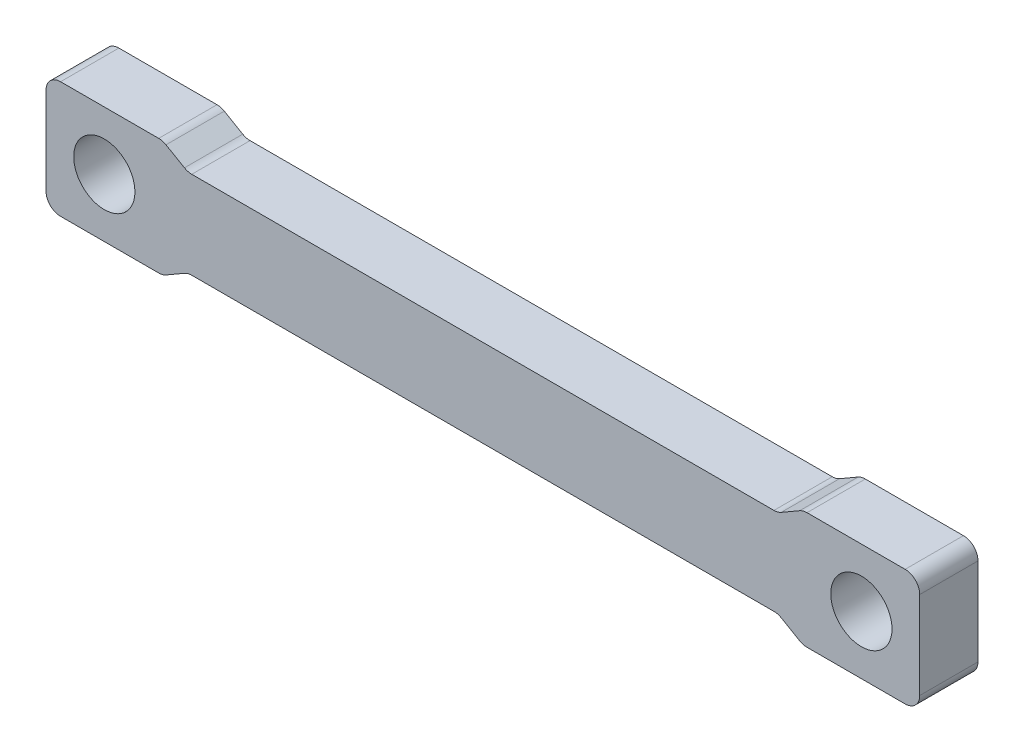
ISO-10303-21;
HEADER;
FILE_DESCRIPTION(('STEP AP214'),'2;1');
FILE_NAME('part.step','',(''),(''),'','','');
FILE_SCHEMA(('AUTOMOTIVE_DESIGN { 1 0 10303 214 1 1 1 1 }'));
ENDSEC;
DATA;
#1=APPLICATION_CONTEXT('core data for automotive mechanical design processes');
#2=APPLICATION_PROTOCOL_DEFINITION('international standard','automotive_design',2000,#1);
#3=PRODUCT_CONTEXT('',#1,'mechanical');
#4=PRODUCT('Part','Part','',(#3));
#5=PRODUCT_RELATED_PRODUCT_CATEGORY('part','',(#4));
#6=PRODUCT_DEFINITION_FORMATION('','',#4);
#7=PRODUCT_DEFINITION_CONTEXT('part definition',#1,'design');
#8=PRODUCT_DEFINITION('design','',#6,#7);
#9=PRODUCT_DEFINITION_SHAPE('','',#8);
#10=(LENGTH_UNIT() NAMED_UNIT(*) SI_UNIT(.MILLI.,.METRE.));
#11=(NAMED_UNIT(*) PLANE_ANGLE_UNIT() SI_UNIT($,.RADIAN.));
#12=(NAMED_UNIT(*) SI_UNIT($,.STERADIAN.) SOLID_ANGLE_UNIT());
#13=UNCERTAINTY_MEASURE_WITH_UNIT(LENGTH_MEASURE(1.E-05),#10,'distance_accuracy_value','');
#14=(GEOMETRIC_REPRESENTATION_CONTEXT(3) GLOBAL_UNCERTAINTY_ASSIGNED_CONTEXT((#13)) GLOBAL_UNIT_ASSIGNED_CONTEXT((#10,
#11,#12)) REPRESENTATION_CONTEXT('',''));
#15=CARTESIAN_POINT('',(0.,0.,0.));
#16=DIRECTION('',(0.,0.,1.));
#17=DIRECTION('',(1.,0.,0.));
#18=AXIS2_PLACEMENT_3D('',#15,#16,#17);
#19=CARTESIAN_POINT('',(-26.7785361810537,14.6,-10.));
#20=DIRECTION('',(0.,0.,1.));
#21=DIRECTION('',(1.,0.,0.));
#22=AXIS2_PLACEMENT_3D('',#19,#20,#21);
#23=CYLINDRICAL_SURFACE('',#22,1.05);
#24=CARTESIAN_POINT('',(-26.7785361810537,14.6,0.));
#25=DIRECTION('',(0.,0.,1.));
#26=DIRECTION('',(1.,0.,0.));
#27=AXIS2_PLACEMENT_3D('',#24,#25,#26);
#28=CIRCLE('',#27,1.05);
#29=CARTESIAN_POINT('',(-25.7285361810537,14.6,0.));
#30=VERTEX_POINT('',#29);
#31=EDGE_CURVE('E445',#30,#30,#28,.F.);
#32=ORIENTED_EDGE('',*,*,#31,.T.);
#33=EDGE_LOOP('',(#32));
#34=FACE_BOUND('',#33,.T.);
#35=CARTESIAN_POINT('',(-26.7785361810537,14.6,2.));
#36=DIRECTION('',(0.,0.,1.));
#37=DIRECTION('',(1.,0.,0.));
#38=AXIS2_PLACEMENT_3D('',#35,#36,#37);
#39=CIRCLE('',#38,1.05);
#40=CARTESIAN_POINT('',(-25.7285361810537,14.6,2.));
#41=VERTEX_POINT('',#40);
#42=EDGE_CURVE('E442',#41,#41,#39,.T.);
#43=ORIENTED_EDGE('',*,*,#42,.T.);
#44=EDGE_LOOP('',(#43));
#45=FACE_BOUND('',#44,.T.);
#46=ADVANCED_FACE('F67',(#34,#45),#23,.F.);
#47=CARTESIAN_POINT('',(-52.75,14.6,-10.));
#48=DIRECTION('',(0.,0.,1.));
#49=DIRECTION('',(1.,0.,0.));
#50=AXIS2_PLACEMENT_3D('',#47,#48,#49);
#51=CYLINDRICAL_SURFACE('',#50,1.05);
#52=CARTESIAN_POINT('',(-52.75,14.6,0.));
#53=DIRECTION('',(0.,0.,1.));
#54=DIRECTION('',(1.,0.,0.));
#55=AXIS2_PLACEMENT_3D('',#52,#53,#54);
#56=CIRCLE('',#55,1.05);
#57=CARTESIAN_POINT('',(-51.7,14.6,0.));
#58=VERTEX_POINT('',#57);
#59=EDGE_CURVE('E448',#58,#58,#56,.F.);
#60=ORIENTED_EDGE('',*,*,#59,.T.);
#61=EDGE_LOOP('',(#60));
#62=FACE_BOUND('',#61,.T.);
#63=CARTESIAN_POINT('',(-52.75,14.6,2.));
#64=DIRECTION('',(0.,0.,1.));
#65=DIRECTION('',(1.,0.,0.));
#66=AXIS2_PLACEMENT_3D('',#63,#64,#65);
#67=CIRCLE('',#66,1.05);
#68=CARTESIAN_POINT('',(-51.7,14.6,2.));
#69=VERTEX_POINT('',#68);
#70=EDGE_CURVE('E380',#69,#69,#67,.T.);
#71=ORIENTED_EDGE('',*,*,#70,.T.);
#72=EDGE_LOOP('',(#71));
#73=FACE_BOUND('',#72,.T.);
#74=ADVANCED_FACE('F452',(#62,#73),#51,.F.);
#75=CARTESIAN_POINT('',(0.,0.,2.));
#76=DIRECTION('',(0.,0.,1.));
#77=DIRECTION('',(1.,0.,0.));
#78=AXIS2_PLACEMENT_3D('',#75,#76,#77);
#79=PLANE('',#78);
#80=ORIENTED_EDGE('',*,*,#70,.F.);
#81=EDGE_LOOP('',(#80));
#82=FACE_BOUND('',#81,.T.);
#83=DIRECTION('',(-1.,0.,0.));
#84=VECTOR('',#83,1.);
#85=CARTESIAN_POINT('',(-24.7785361810537,16.6,2.));
#86=LINE('',#85,#84);
#87=CARTESIAN_POINT('',(-25.2785361810537,16.6,2.));
#88=VERTEX_POINT('',#87);
#89=CARTESIAN_POINT('',(-28.6445615848381,16.6,2.));
#90=VERTEX_POINT('',#89);
#91=EDGE_CURVE('E413',#88,#90,#86,.T.);
#92=ORIENTED_EDGE('',*,*,#91,.T.);
#93=CARTESIAN_POINT('',(-28.6445615848381,16.1,2.));
#94=DIRECTION('',(0.,0.,1.));
#95=DIRECTION('',(1.,0.,0.));
#96=AXIS2_PLACEMENT_3D('',#93,#94,#95);
#97=CIRCLE('',#96,0.5);
#98=CARTESIAN_POINT('',(-28.8945615848381,16.5330127018922,2.));
#99=VERTEX_POINT('',#98);
#100=EDGE_CURVE('E299',#90,#99,#97,.T.);
#101=ORIENTED_EDGE('',*,*,#100,.T.);
#102=DIRECTION('',(-0.866025403784438,-0.500000000000002,0.));
#103=VECTOR('',#102,1.);
#104=CARTESIAN_POINT('',(-28.7785361810537,16.6,2.));
#105=LINE('',#104,#103);
#106=CARTESIAN_POINT('',(-29.5285361810537,16.1669872981078,2.));
#107=VERTEX_POINT('',#106);
#108=EDGE_CURVE('E248',#99,#107,#105,.T.);
#109=ORIENTED_EDGE('',*,*,#108,.T.);
#110=CARTESIAN_POINT('',(-29.7785361810537,16.6,2.));
#111=DIRECTION('',(0.,0.,1.));
#112=DIRECTION('',(1.,0.,0.));
#113=AXIS2_PLACEMENT_3D('',#110,#111,#112);
#114=CIRCLE('',#113,0.5);
#115=CARTESIAN_POINT('',(-29.7785361810537,16.1,2.));
#116=VERTEX_POINT('',#115);
#117=EDGE_CURVE('E351',#107,#116,#114,.F.);
#118=ORIENTED_EDGE('',*,*,#117,.T.);
#119=DIRECTION('',(-1.,0.,0.));
#120=VECTOR('',#119,1.);
#121=CARTESIAN_POINT('',(-29.6445615848381,16.1,2.));
#122=LINE('',#121,#120);
#123=CARTESIAN_POINT('',(-49.75,16.1,2.));
#124=VERTEX_POINT('',#123);
#125=EDGE_CURVE('E371',#116,#124,#122,.T.);
#126=ORIENTED_EDGE('',*,*,#125,.T.);
#127=CARTESIAN_POINT('',(-49.75,16.6,2.));
#128=DIRECTION('',(0.,0.,1.));
#129=DIRECTION('',(1.,0.,0.));
#130=AXIS2_PLACEMENT_3D('',#127,#128,#129);
#131=CIRCLE('',#130,0.5);
#132=CARTESIAN_POINT('',(-50.,16.1669872981078,2.));
#133=VERTEX_POINT('',#132);
#134=EDGE_CURVE('E12',#124,#133,#131,.F.);
#135=ORIENTED_EDGE('',*,*,#134,.T.);
#136=DIRECTION('',(-0.866025403784439,0.499999999999999,0.));
#137=VECTOR('',#136,1.);
#138=CARTESIAN_POINT('',(-49.8839745962156,16.1,2.));
#139=LINE('',#138,#137);
#140=CARTESIAN_POINT('',(-50.6339745962156,16.5330127018922,2.));
#141=VERTEX_POINT('',#140);
#142=EDGE_CURVE('E268',#133,#141,#139,.T.);
#143=ORIENTED_EDGE('',*,*,#142,.T.);
#144=CARTESIAN_POINT('',(-50.8839745962156,16.1,2.));
#145=DIRECTION('',(0.,0.,1.));
#146=DIRECTION('',(1.,0.,0.));
#147=AXIS2_PLACEMENT_3D('',#144,#145,#146);
#148=CIRCLE('',#147,0.5);
#149=CARTESIAN_POINT('',(-50.8839745962156,16.6,2.));
#150=VERTEX_POINT('',#149);
#151=EDGE_CURVE('E289',#141,#150,#148,.T.);
#152=ORIENTED_EDGE('',*,*,#151,.T.);
#153=DIRECTION('',(-1.,0.,0.));
#154=VECTOR('',#153,1.);
#155=CARTESIAN_POINT('',(-50.75,16.6,2.));
#156=LINE('',#155,#154);
#157=CARTESIAN_POINT('',(-54.25,16.6,2.));
#158=VERTEX_POINT('',#157);
#159=EDGE_CURVE('E267',#150,#158,#156,.T.);
#160=ORIENTED_EDGE('',*,*,#159,.T.);
#161=CARTESIAN_POINT('',(-54.25,16.1,2.));
#162=DIRECTION('',(0.,0.,1.));
#163=DIRECTION('',(1.,0.,0.));
#164=AXIS2_PLACEMENT_3D('',#161,#162,#163);
#165=CIRCLE('',#164,0.5);
#166=CARTESIAN_POINT('',(-54.75,16.1,2.));
#167=VERTEX_POINT('',#166);
#168=EDGE_CURVE('E285',#158,#167,#165,.T.);
#169=ORIENTED_EDGE('',*,*,#168,.T.);
#170=DIRECTION('',(0.,-1.,0.));
#171=VECTOR('',#170,1.);
#172=CARTESIAN_POINT('',(-54.75,16.6,2.));
#173=LINE('',#172,#171);
#174=CARTESIAN_POINT('',(-54.75,13.1,2.));
#175=VERTEX_POINT('',#174);
#176=EDGE_CURVE('E435',#167,#175,#173,.T.);
#177=ORIENTED_EDGE('',*,*,#176,.T.);
#178=CARTESIAN_POINT('',(-54.25,13.1,2.));
#179=DIRECTION('',(0.,0.,1.));
#180=DIRECTION('',(1.,0.,0.));
#181=AXIS2_PLACEMENT_3D('',#178,#179,#180);
#182=CIRCLE('',#181,0.5);
#183=CARTESIAN_POINT('',(-54.25,12.6,2.));
#184=VERTEX_POINT('',#183);
#185=EDGE_CURVE('E287',#175,#184,#182,.T.);
#186=ORIENTED_EDGE('',*,*,#185,.T.);
#187=DIRECTION('',(1.,0.,0.));
#188=VECTOR('',#187,1.);
#189=CARTESIAN_POINT('',(-54.75,12.6,2.));
#190=LINE('',#189,#188);
#191=CARTESIAN_POINT('',(-50.8839745962156,12.6,2.));
#192=VERTEX_POINT('',#191);
#193=EDGE_CURVE('E432',#184,#192,#190,.T.);
#194=ORIENTED_EDGE('',*,*,#193,.T.);
#195=CARTESIAN_POINT('',(-50.8839745962156,13.1,2.));
#196=DIRECTION('',(0.,0.,1.));
#197=DIRECTION('',(1.,0.,0.));
#198=AXIS2_PLACEMENT_3D('',#195,#196,#197);
#199=CIRCLE('',#198,0.5);
#200=CARTESIAN_POINT('',(-50.6339745962156,12.6669872981078,2.));
#201=VERTEX_POINT('',#200);
#202=EDGE_CURVE('E291',#192,#201,#199,.T.);
#203=ORIENTED_EDGE('',*,*,#202,.T.);
#204=DIRECTION('',(0.866025403784438,0.500000000000002,0.));
#205=VECTOR('',#204,1.);
#206=CARTESIAN_POINT('',(-50.75,12.6,2.));
#207=LINE('',#206,#205);
#208=CARTESIAN_POINT('',(-50.,13.0330127018922,2.));
#209=VERTEX_POINT('',#208);
#210=EDGE_CURVE('E429',#201,#209,#207,.T.);
#211=ORIENTED_EDGE('',*,*,#210,.T.);
#212=CARTESIAN_POINT('',(-49.75,12.6,2.));
#213=DIRECTION('',(0.,0.,1.));
#214=DIRECTION('',(1.,0.,0.));
#215=AXIS2_PLACEMENT_3D('',#212,#213,#214);
#216=CIRCLE('',#215,0.5);
#217=CARTESIAN_POINT('',(-49.75,13.1,2.));
#218=VERTEX_POINT('',#217);
#219=EDGE_CURVE('E359',#209,#218,#216,.F.);
#220=ORIENTED_EDGE('',*,*,#219,.T.);
#221=DIRECTION('',(1.,0.,0.));
#222=VECTOR('',#221,1.);
#223=CARTESIAN_POINT('',(-49.8839745962156,13.1,2.));
#224=LINE('',#223,#222);
#225=CARTESIAN_POINT('',(-29.7785361810536,13.1,2.));
#226=VERTEX_POINT('',#225);
#227=EDGE_CURVE('E426',#218,#226,#224,.T.);
#228=ORIENTED_EDGE('',*,*,#227,.T.);
#229=CARTESIAN_POINT('',(-29.7785361810536,12.6,2.));
#230=DIRECTION('',(0.,0.,1.));
#231=DIRECTION('',(1.,0.,0.));
#232=AXIS2_PLACEMENT_3D('',#229,#230,#231);
#233=CIRCLE('',#232,0.5);
#234=CARTESIAN_POINT('',(-29.5285361810536,13.0330127018922,2.));
#235=VERTEX_POINT('',#234);
#236=EDGE_CURVE('E355',#226,#235,#233,.F.);
#237=ORIENTED_EDGE('',*,*,#236,.T.);
#238=DIRECTION('',(0.866025403784438,-0.500000000000002,0.));
#239=VECTOR('',#238,1.);
#240=CARTESIAN_POINT('',(-29.6445615848381,13.1,2.));
#241=LINE('',#240,#239);
#242=CARTESIAN_POINT('',(-28.8945615848381,12.6669872981078,2.));
#243=VERTEX_POINT('',#242);
#244=EDGE_CURVE('E423',#235,#243,#241,.T.);
#245=ORIENTED_EDGE('',*,*,#244,.T.);
#246=CARTESIAN_POINT('',(-28.6445615848381,13.1,2.));
#247=DIRECTION('',(0.,0.,1.));
#248=DIRECTION('',(1.,0.,0.));
#249=AXIS2_PLACEMENT_3D('',#246,#247,#248);
#250=CIRCLE('',#249,0.5);
#251=CARTESIAN_POINT('',(-28.6445615848381,12.6,2.));
#252=VERTEX_POINT('',#251);
#253=EDGE_CURVE('E293',#243,#252,#250,.T.);
#254=ORIENTED_EDGE('',*,*,#253,.T.);
#255=DIRECTION('',(1.,0.,0.));
#256=VECTOR('',#255,1.);
#257=CARTESIAN_POINT('',(-28.7785361810537,12.6,2.));
#258=LINE('',#257,#256);
#259=CARTESIAN_POINT('',(-25.2785361810537,12.6,2.));
#260=VERTEX_POINT('',#259);
#261=EDGE_CURVE('E418',#252,#260,#258,.T.);
#262=ORIENTED_EDGE('',*,*,#261,.T.);
#263=CARTESIAN_POINT('',(-25.2785361810537,13.1,2.));
#264=DIRECTION('',(0.,0.,1.));
#265=DIRECTION('',(1.,0.,0.));
#266=AXIS2_PLACEMENT_3D('',#263,#264,#265);
#267=CIRCLE('',#266,0.5);
#268=CARTESIAN_POINT('',(-24.7785361810537,13.1,2.));
#269=VERTEX_POINT('',#268);
#270=EDGE_CURVE('E295',#260,#269,#267,.T.);
#271=ORIENTED_EDGE('',*,*,#270,.T.);
#272=DIRECTION('',(0.,1.,0.));
#273=VECTOR('',#272,1.);
#274=CARTESIAN_POINT('',(-24.7785361810537,12.6,2.));
#275=LINE('',#274,#273);
#276=CARTESIAN_POINT('',(-24.7785361810537,16.1,2.));
#277=VERTEX_POINT('',#276);
#278=EDGE_CURVE('E414',#269,#277,#275,.T.);
#279=ORIENTED_EDGE('',*,*,#278,.T.);
#280=CARTESIAN_POINT('',(-25.2785361810537,16.1,2.));
#281=DIRECTION('',(0.,0.,1.));
#282=DIRECTION('',(1.,0.,0.));
#283=AXIS2_PLACEMENT_3D('',#280,#281,#282);
#284=CIRCLE('',#283,0.5);
#285=EDGE_CURVE('E297',#277,#88,#284,.T.);
#286=ORIENTED_EDGE('',*,*,#285,.T.);
#287=EDGE_LOOP('',(#92,#101,#109,#118,#126,#135,#143,#152,#160,#169,#177,#186,#194,#203,#211,
#220,#228,#237,#245,#254,#262,#271,#279,#286));
#288=FACE_BOUND('',#287,.T.);
#289=ORIENTED_EDGE('',*,*,#42,.F.);
#290=EDGE_LOOP('',(#289));
#291=FACE_BOUND('',#290,.T.);
#292=ADVANCED_FACE('F411',(#82,#288,#291),#79,.T.);
#293=CARTESIAN_POINT('',(-50.75,16.6,2.));
#294=DIRECTION('',(0.,-1.,0.));
#295=DIRECTION('',(0.,0.,-1.));
#296=AXIS2_PLACEMENT_3D('',#293,#294,#295);
#297=PLANE('',#296);
#298=ORIENTED_EDGE('',*,*,#159,.F.);
#299=DIRECTION('',(0.,0.,-1.));
#300=VECTOR('',#299,1.);
#301=CARTESIAN_POINT('',(-50.8839745962156,16.6,2.));
#302=LINE('',#301,#300);
#303=CARTESIAN_POINT('',(-50.8839745962156,16.6,0.));
#304=VERTEX_POINT('',#303);
#305=EDGE_CURVE('E342',#150,#304,#302,.T.);
#306=ORIENTED_EDGE('',*,*,#305,.T.);
#307=DIRECTION('',(-1.,0.,0.));
#308=VECTOR('',#307,1.);
#309=CARTESIAN_POINT('',(-50.75,16.6,0.));
#310=LINE('',#309,#308);
#311=CARTESIAN_POINT('',(-54.25,16.6,0.));
#312=VERTEX_POINT('',#311);
#313=EDGE_CURVE('E376',#304,#312,#310,.T.);
#314=ORIENTED_EDGE('',*,*,#313,.T.);
#315=DIRECTION('',(0.,0.,-1.));
#316=VECTOR('',#315,1.);
#317=CARTESIAN_POINT('',(-54.25,16.6,2.));
#318=LINE('',#317,#316);
#319=EDGE_CURVE('E340',#312,#158,#318,.F.);
#320=ORIENTED_EDGE('',*,*,#319,.T.);
#321=EDGE_LOOP('',(#298,#306,#314,#320));
#322=FACE_BOUND('',#321,.T.);
#323=ADVANCED_FACE('F559',(#322),#297,.F.);
#324=CARTESIAN_POINT('',(-54.75,16.6,2.));
#325=DIRECTION('',(1.,0.,0.));
#326=DIRECTION('',(0.,0.,-1.));
#327=AXIS2_PLACEMENT_3D('',#324,#325,#326);
#328=PLANE('',#327);
#329=DIRECTION('',(0.,-1.,0.));
#330=VECTOR('',#329,1.);
#331=CARTESIAN_POINT('',(-54.75,16.6,0.));
#332=LINE('',#331,#330);
#333=CARTESIAN_POINT('',(-54.75,16.1,0.));
#334=VERTEX_POINT('',#333);
#335=CARTESIAN_POINT('',(-54.75,13.1,0.));
#336=VERTEX_POINT('',#335);
#337=EDGE_CURVE('E379',#334,#336,#332,.T.);
#338=ORIENTED_EDGE('',*,*,#337,.T.);
#339=DIRECTION('',(0.,0.,-1.));
#340=VECTOR('',#339,1.);
#341=CARTESIAN_POINT('',(-54.75,13.1,2.));
#342=LINE('',#341,#340);
#343=EDGE_CURVE('E348',#336,#175,#342,.F.);
#344=ORIENTED_EDGE('',*,*,#343,.T.);
#345=ORIENTED_EDGE('',*,*,#176,.F.);
#346=DIRECTION('',(0.,0.,-1.));
#347=VECTOR('',#346,1.);
#348=CARTESIAN_POINT('',(-54.75,16.1,2.));
#349=LINE('',#348,#347);
#350=EDGE_CURVE('E345',#167,#334,#349,.T.);
#351=ORIENTED_EDGE('',*,*,#350,.T.);
#352=EDGE_LOOP('',(#338,#344,#345,#351));
#353=FACE_BOUND('',#352,.T.);
#354=ADVANCED_FACE('F552',(#353),#328,.F.);
#355=CARTESIAN_POINT('',(-54.75,12.6,2.));
#356=DIRECTION('',(0.,1.,0.));
#357=DIRECTION('',(0.,0.,1.));
#358=AXIS2_PLACEMENT_3D('',#355,#356,#357);
#359=PLANE('',#358);
#360=DIRECTION('',(1.,0.,0.));
#361=VECTOR('',#360,1.);
#362=CARTESIAN_POINT('',(-54.75,12.6,0.));
#363=LINE('',#362,#361);
#364=CARTESIAN_POINT('',(-54.25,12.6,0.));
#365=VERTEX_POINT('',#364);
#366=CARTESIAN_POINT('',(-50.8839745962156,12.6,0.));
#367=VERTEX_POINT('',#366);
#368=EDGE_CURVE('E383',#365,#367,#363,.T.);
#369=ORIENTED_EDGE('',*,*,#368,.T.);
#370=DIRECTION('',(0.,0.,-1.));
#371=VECTOR('',#370,1.);
#372=CARTESIAN_POINT('',(-50.8839745962156,12.6,2.));
#373=LINE('',#372,#371);
#374=EDGE_CURVE('E334',#367,#192,#373,.F.);
#375=ORIENTED_EDGE('',*,*,#374,.T.);
#376=ORIENTED_EDGE('',*,*,#193,.F.);
#377=DIRECTION('',(0.,0.,-1.));
#378=VECTOR('',#377,1.);
#379=CARTESIAN_POINT('',(-54.25,12.6,2.));
#380=LINE('',#379,#378);
#381=EDGE_CURVE('E331',#184,#365,#380,.T.);
#382=ORIENTED_EDGE('',*,*,#381,.T.);
#383=EDGE_LOOP('',(#369,#375,#376,#382));
#384=FACE_BOUND('',#383,.T.);
#385=ADVANCED_FACE('F519',(#384),#359,.F.);
#386=CARTESIAN_POINT('',(-50.75,12.6,2.));
#387=DIRECTION('',(-0.500000000000002,0.866025403784438,0.));
#388=DIRECTION('',(-0.866025403784438,-0.500000000000002,0.));
#389=AXIS2_PLACEMENT_3D('',#386,#387,#388);
#390=PLANE('',#389);
#391=DIRECTION('',(0.866025403784438,0.500000000000002,0.));
#392=VECTOR('',#391,1.);
#393=CARTESIAN_POINT('',(-50.75,12.6,0.));
#394=LINE('',#393,#392);
#395=CARTESIAN_POINT('',(-50.6339745962156,12.6669872981078,0.));
#396=VERTEX_POINT('',#395);
#397=CARTESIAN_POINT('',(-50.,13.0330127018922,0.));
#398=VERTEX_POINT('',#397);
#399=EDGE_CURVE('E386',#396,#398,#394,.T.);
#400=ORIENTED_EDGE('',*,*,#399,.T.);
#401=DIRECTION('',(0.,0.,-1.));
#402=VECTOR('',#401,1.);
#403=CARTESIAN_POINT('',(-50.,13.0330127018922,2.));
#404=LINE('',#403,#402);
#405=EDGE_CURVE('E329',#398,#209,#404,.F.);
#406=ORIENTED_EDGE('',*,*,#405,.T.);
#407=ORIENTED_EDGE('',*,*,#210,.F.);
#408=DIRECTION('',(0.,0.,-1.));
#409=VECTOR('',#408,1.);
#410=CARTESIAN_POINT('',(-50.6339745962156,12.6669872981078,2.));
#411=LINE('',#410,#409);
#412=EDGE_CURVE('E326',#201,#396,#411,.T.);
#413=ORIENTED_EDGE('',*,*,#412,.T.);
#414=EDGE_LOOP('',(#400,#406,#407,#413));
#415=FACE_BOUND('',#414,.T.);
#416=ADVANCED_FACE('F526',(#415),#390,.F.);
#417=CARTESIAN_POINT('',(-49.8839745962156,13.1,2.));
#418=DIRECTION('',(0.,1.,0.));
#419=DIRECTION('',(0.,0.,1.));
#420=AXIS2_PLACEMENT_3D('',#417,#418,#419);
#421=PLANE('',#420);
#422=DIRECTION('',(1.,0.,0.));
#423=VECTOR('',#422,1.);
#424=CARTESIAN_POINT('',(-49.8839745962156,13.1,0.));
#425=LINE('',#424,#423);
#426=CARTESIAN_POINT('',(-49.75,13.1,0.));
#427=VERTEX_POINT('',#426);
#428=CARTESIAN_POINT('',(-29.7785361810536,13.1,0.));
#429=VERTEX_POINT('',#428);
#430=EDGE_CURVE('E389',#427,#429,#425,.T.);
#431=ORIENTED_EDGE('',*,*,#430,.T.);
#432=DIRECTION('',(0.,0.,-1.));
#433=VECTOR('',#432,1.);
#434=CARTESIAN_POINT('',(-29.7785361810536,13.1,2.));
#435=LINE('',#434,#433);
#436=EDGE_CURVE('E324',#429,#226,#435,.F.);
#437=ORIENTED_EDGE('',*,*,#436,.T.);
#438=ORIENTED_EDGE('',*,*,#227,.F.);
#439=DIRECTION('',(0.,0.,-1.));
#440=VECTOR('',#439,1.);
#441=CARTESIAN_POINT('',(-49.75,13.1,0.));
#442=LINE('',#441,#440);
#443=EDGE_CURVE('E321',#218,#427,#442,.T.);
#444=ORIENTED_EDGE('',*,*,#443,.T.);
#445=EDGE_LOOP('',(#431,#437,#438,#444));
#446=FACE_BOUND('',#445,.T.);
#447=ADVANCED_FACE('F533',(#446),#421,.F.);
#448=CARTESIAN_POINT('',(-29.6445615848381,13.1,2.));
#449=DIRECTION('',(0.500000000000002,0.866025403784438,0.));
#450=DIRECTION('',(-0.866025403784438,0.500000000000002,0.));
#451=AXIS2_PLACEMENT_3D('',#448,#449,#450);
#452=PLANE('',#451);
#453=DIRECTION('',(0.866025403784438,-0.500000000000002,0.));
#454=VECTOR('',#453,1.);
#455=CARTESIAN_POINT('',(-29.6445615848381,13.1,0.));
#456=LINE('',#455,#454);
#457=CARTESIAN_POINT('',(-29.5285361810536,13.0330127018922,0.));
#458=VERTEX_POINT('',#457);
#459=CARTESIAN_POINT('',(-28.8945615848381,12.6669872981078,0.));
#460=VERTEX_POINT('',#459);
#461=EDGE_CURVE('E392',#458,#460,#456,.T.);
#462=ORIENTED_EDGE('',*,*,#461,.T.);
#463=DIRECTION('',(0.,0.,-1.));
#464=VECTOR('',#463,1.);
#465=CARTESIAN_POINT('',(-28.8945615848381,12.6669872981078,2.));
#466=LINE('',#465,#464);
#467=EDGE_CURVE('E319',#460,#243,#466,.F.);
#468=ORIENTED_EDGE('',*,*,#467,.T.);
#469=ORIENTED_EDGE('',*,*,#244,.F.);
#470=DIRECTION('',(0.,0.,-1.));
#471=VECTOR('',#470,1.);
#472=CARTESIAN_POINT('',(-29.5285361810536,13.0330127018922,0.));
#473=LINE('',#472,#471);
#474=EDGE_CURVE('E316',#235,#458,#473,.T.);
#475=ORIENTED_EDGE('',*,*,#474,.T.);
#476=EDGE_LOOP('',(#462,#468,#469,#475));
#477=FACE_BOUND('',#476,.T.);
#478=ADVANCED_FACE('F540',(#477),#452,.F.);
#479=CARTESIAN_POINT('',(-28.7785361810537,12.6,2.));
#480=DIRECTION('',(0.,1.,0.));
#481=DIRECTION('',(0.,0.,1.));
#482=AXIS2_PLACEMENT_3D('',#479,#480,#481);
#483=PLANE('',#482);
#484=DIRECTION('',(1.,0.,0.));
#485=VECTOR('',#484,1.);
#486=CARTESIAN_POINT('',(-28.7785361810537,12.6,0.));
#487=LINE('',#486,#485);
#488=CARTESIAN_POINT('',(-28.6445615848381,12.6,0.));
#489=VERTEX_POINT('',#488);
#490=CARTESIAN_POINT('',(-25.2785361810537,12.6,0.));
#491=VERTEX_POINT('',#490);
#492=EDGE_CURVE('E395',#489,#491,#487,.T.);
#493=ORIENTED_EDGE('',*,*,#492,.T.);
#494=DIRECTION('',(0.,0.,-1.));
#495=VECTOR('',#494,1.);
#496=CARTESIAN_POINT('',(-25.2785361810537,12.6,2.));
#497=LINE('',#496,#495);
#498=EDGE_CURVE('E314',#491,#260,#497,.F.);
#499=ORIENTED_EDGE('',*,*,#498,.T.);
#500=ORIENTED_EDGE('',*,*,#261,.F.);
#501=DIRECTION('',(0.,0.,-1.));
#502=VECTOR('',#501,1.);
#503=CARTESIAN_POINT('',(-28.6445615848381,12.6,2.));
#504=LINE('',#503,#502);
#505=EDGE_CURVE('E311',#252,#489,#504,.T.);
#506=ORIENTED_EDGE('',*,*,#505,.T.);
#507=EDGE_LOOP('',(#493,#499,#500,#506));
#508=FACE_BOUND('',#507,.T.);
#509=ADVANCED_FACE('F547',(#508),#483,.F.);
#510=CARTESIAN_POINT('',(-24.7785361810537,12.6,2.));
#511=DIRECTION('',(-1.,0.,0.));
#512=DIRECTION('',(0.,-1.,0.));
#513=AXIS2_PLACEMENT_3D('',#510,#511,#512);
#514=PLANE('',#513);
#515=DIRECTION('',(0.,1.,0.));
#516=VECTOR('',#515,1.);
#517=CARTESIAN_POINT('',(-24.7785361810537,12.6,0.));
#518=LINE('',#517,#516);
#519=CARTESIAN_POINT('',(-24.7785361810537,13.1,0.));
#520=VERTEX_POINT('',#519);
#521=CARTESIAN_POINT('',(-24.7785361810537,16.1,0.));
#522=VERTEX_POINT('',#521);
#523=EDGE_CURVE('E262',#520,#522,#518,.T.);
#524=ORIENTED_EDGE('',*,*,#523,.T.);
#525=DIRECTION('',(0.,0.,-1.));
#526=VECTOR('',#525,1.);
#527=CARTESIAN_POINT('',(-24.7785361810537,16.1,2.));
#528=LINE('',#527,#526);
#529=EDGE_CURVE('E309',#522,#277,#528,.F.);
#530=ORIENTED_EDGE('',*,*,#529,.T.);
#531=ORIENTED_EDGE('',*,*,#278,.F.);
#532=DIRECTION('',(0.,0.,-1.));
#533=VECTOR('',#532,1.);
#534=CARTESIAN_POINT('',(-24.7785361810537,13.1,2.));
#535=LINE('',#534,#533);
#536=EDGE_CURVE('E306',#269,#520,#535,.T.);
#537=ORIENTED_EDGE('',*,*,#536,.T.);
#538=EDGE_LOOP('',(#524,#530,#531,#537));
#539=FACE_BOUND('',#538,.T.);
#540=ADVANCED_FACE('F401',(#539),#514,.F.);
#541=CARTESIAN_POINT('',(-24.7785361810537,16.6,2.));
#542=DIRECTION('',(0.,-1.,0.));
#543=DIRECTION('',(0.,0.,-1.));
#544=AXIS2_PLACEMENT_3D('',#541,#542,#543);
#545=PLANE('',#544);
#546=DIRECTION('',(-1.,0.,0.));
#547=VECTOR('',#546,1.);
#548=CARTESIAN_POINT('',(-24.7785361810537,16.6,0.));
#549=LINE('',#548,#547);
#550=CARTESIAN_POINT('',(-25.2785361810537,16.6,0.));
#551=VERTEX_POINT('',#550);
#552=CARTESIAN_POINT('',(-28.6445615848381,16.6,0.));
#553=VERTEX_POINT('',#552);
#554=EDGE_CURVE('E257',#551,#553,#549,.T.);
#555=ORIENTED_EDGE('',*,*,#554,.T.);
#556=DIRECTION('',(0.,0.,-1.));
#557=VECTOR('',#556,1.);
#558=CARTESIAN_POINT('',(-28.6445615848381,16.6,2.));
#559=LINE('',#558,#557);
#560=EDGE_CURVE('E233',#553,#90,#559,.F.);
#561=ORIENTED_EDGE('',*,*,#560,.T.);
#562=ORIENTED_EDGE('',*,*,#91,.F.);
#563=DIRECTION('',(0.,0.,-1.));
#564=VECTOR('',#563,1.);
#565=CARTESIAN_POINT('',(-25.2785361810537,16.6,2.));
#566=LINE('',#565,#564);
#567=EDGE_CURVE('E238',#88,#551,#566,.T.);
#568=ORIENTED_EDGE('',*,*,#567,.T.);
#569=EDGE_LOOP('',(#555,#561,#562,#568));
#570=FACE_BOUND('',#569,.T.);
#571=ADVANCED_FACE('F416',(#570),#545,.F.);
#572=CARTESIAN_POINT('',(-28.7785361810537,16.6,2.));
#573=DIRECTION('',(0.500000000000002,-0.866025403784438,0.));
#574=DIRECTION('',(0.866025403784438,0.500000000000002,0.));
#575=AXIS2_PLACEMENT_3D('',#572,#573,#574);
#576=PLANE('',#575);
#577=ORIENTED_EDGE('',*,*,#108,.F.);
#578=DIRECTION('',(0.,0.,-1.));
#579=VECTOR('',#578,1.);
#580=CARTESIAN_POINT('',(-28.8945615848381,16.5330127018922,2.));
#581=LINE('',#580,#579);
#582=CARTESIAN_POINT('',(-28.8945615848381,16.5330127018922,0.));
#583=VERTEX_POINT('',#582);
#584=EDGE_CURVE('E232',#99,#583,#581,.T.);
#585=ORIENTED_EDGE('',*,*,#584,.T.);
#586=DIRECTION('',(-0.866025403784438,-0.500000000000002,0.));
#587=VECTOR('',#586,1.);
#588=CARTESIAN_POINT('',(-28.7785361810537,16.6,0.));
#589=LINE('',#588,#587);
#590=CARTESIAN_POINT('',(-29.5285361810537,16.1669872981078,0.));
#591=VERTEX_POINT('',#590);
#592=EDGE_CURVE('E245',#583,#591,#589,.T.);
#593=ORIENTED_EDGE('',*,*,#592,.T.);
#594=DIRECTION('',(0.,0.,-1.));
#595=VECTOR('',#594,1.);
#596=CARTESIAN_POINT('',(-29.5285361810537,16.1669872981078,2.));
#597=LINE('',#596,#595);
#598=EDGE_CURVE('E250',#591,#107,#597,.F.);
#599=ORIENTED_EDGE('',*,*,#598,.T.);
#600=EDGE_LOOP('',(#577,#585,#593,#599));
#601=FACE_BOUND('',#600,.T.);
#602=ADVANCED_FACE('F244',(#601),#576,.F.);
#603=CARTESIAN_POINT('',(-29.6445615848381,16.1,2.));
#604=DIRECTION('',(0.,-1.,0.));
#605=DIRECTION('',(0.,0.,-1.));
#606=AXIS2_PLACEMENT_3D('',#603,#604,#605);
#607=PLANE('',#606);
#608=ORIENTED_EDGE('',*,*,#125,.F.);
#609=DIRECTION('',(0.,0.,-1.));
#610=VECTOR('',#609,1.);
#611=CARTESIAN_POINT('',(-29.7785361810537,16.1,0.));
#612=LINE('',#611,#610);
#613=CARTESIAN_POINT('',(-29.7785361810537,16.1,0.));
#614=VERTEX_POINT('',#613);
#615=EDGE_CURVE('E303',#116,#614,#612,.T.);
#616=ORIENTED_EDGE('',*,*,#615,.T.);
#617=DIRECTION('',(-1.,0.,0.));
#618=VECTOR('',#617,1.);
#619=CARTESIAN_POINT('',(-29.6445615848381,16.1,0.));
#620=LINE('',#619,#618);
#621=CARTESIAN_POINT('',(-49.75,16.1,0.));
#622=VERTEX_POINT('',#621);
#623=EDGE_CURVE('E256',#614,#622,#620,.T.);
#624=ORIENTED_EDGE('',*,*,#623,.T.);
#625=DIRECTION('',(0.,0.,-1.));
#626=VECTOR('',#625,1.);
#627=CARTESIAN_POINT('',(-49.75,16.1,2.));
#628=LINE('',#627,#626);
#629=EDGE_CURVE('E301',#622,#124,#628,.F.);
#630=ORIENTED_EDGE('',*,*,#629,.T.);
#631=EDGE_LOOP('',(#608,#616,#624,#630));
#632=FACE_BOUND('',#631,.T.);
#633=ADVANCED_FACE('F366',(#632),#607,.F.);
#634=CARTESIAN_POINT('',(-49.8839745962156,16.1,2.));
#635=DIRECTION('',(-0.499999999999999,-0.866025403784439,0.));
#636=DIRECTION('',(0.866025403784439,-0.499999999999999,0.));
#637=AXIS2_PLACEMENT_3D('',#634,#635,#636);
#638=PLANE('',#637);
#639=ORIENTED_EDGE('',*,*,#142,.F.);
#640=DIRECTION('',(0.,0.,-1.));
#641=VECTOR('',#640,1.);
#642=CARTESIAN_POINT('',(-50.,16.1669872981078,0.));
#643=LINE('',#642,#641);
#644=CARTESIAN_POINT('',(-50.,16.1669872981078,0.));
#645=VERTEX_POINT('',#644);
#646=EDGE_CURVE('E337',#133,#645,#643,.T.);
#647=ORIENTED_EDGE('',*,*,#646,.T.);
#648=DIRECTION('',(-0.866025403784439,0.499999999999999,0.));
#649=VECTOR('',#648,1.);
#650=CARTESIAN_POINT('',(-49.8839745962156,16.1,0.));
#651=LINE('',#650,#649);
#652=CARTESIAN_POINT('',(-50.6339745962156,16.5330127018922,0.));
#653=VERTEX_POINT('',#652);
#654=EDGE_CURVE('E260',#645,#653,#651,.T.);
#655=ORIENTED_EDGE('',*,*,#654,.T.);
#656=DIRECTION('',(0.,0.,-1.));
#657=VECTOR('',#656,1.);
#658=CARTESIAN_POINT('',(-50.6339745962156,16.5330127018922,2.));
#659=LINE('',#658,#657);
#660=EDGE_CURVE('E82',#653,#141,#659,.F.);
#661=ORIENTED_EDGE('',*,*,#660,.T.);
#662=EDGE_LOOP('',(#639,#647,#655,#661));
#663=FACE_BOUND('',#662,.T.);
#664=ADVANCED_FACE('F369',(#663),#638,.F.);
#665=CARTESIAN_POINT('',(0.,0.,0.));
#666=DIRECTION('',(0.,0.,1.));
#667=DIRECTION('',(1.,0.,0.));
#668=AXIS2_PLACEMENT_3D('',#665,#666,#667);
#669=PLANE('',#668);
#670=ORIENTED_EDGE('',*,*,#59,.F.);
#671=EDGE_LOOP('',(#670));
#672=FACE_BOUND('',#671,.T.);
#673=ORIENTED_EDGE('',*,*,#592,.F.);
#674=CARTESIAN_POINT('',(-28.6445615848381,16.1,0.));
#675=DIRECTION('',(0.,0.,1.));
#676=DIRECTION('',(1.,0.,0.));
#677=AXIS2_PLACEMENT_3D('',#674,#675,#676);
#678=CIRCLE('',#677,0.5);
#679=EDGE_CURVE('E228',#583,#553,#678,.F.);
#680=ORIENTED_EDGE('',*,*,#679,.T.);
#681=ORIENTED_EDGE('',*,*,#554,.F.);
#682=CARTESIAN_POINT('',(-25.2785361810537,16.1,0.));
#683=DIRECTION('',(0.,0.,1.));
#684=DIRECTION('',(1.,0.,0.));
#685=AXIS2_PLACEMENT_3D('',#682,#683,#684);
#686=CIRCLE('',#685,0.5);
#687=EDGE_CURVE('E239',#551,#522,#686,.F.);
#688=ORIENTED_EDGE('',*,*,#687,.T.);
#689=ORIENTED_EDGE('',*,*,#523,.F.);
#690=CARTESIAN_POINT('',(-25.2785361810537,13.1,0.));
#691=DIRECTION('',(0.,0.,1.));
#692=DIRECTION('',(1.,0.,0.));
#693=AXIS2_PLACEMENT_3D('',#690,#691,#692);
#694=CIRCLE('',#693,0.5);
#695=EDGE_CURVE('E279',#520,#491,#694,.F.);
#696=ORIENTED_EDGE('',*,*,#695,.T.);
#697=ORIENTED_EDGE('',*,*,#492,.F.);
#698=CARTESIAN_POINT('',(-28.6445615848381,13.1,0.));
#699=DIRECTION('',(0.,0.,1.));
#700=DIRECTION('',(1.,0.,0.));
#701=AXIS2_PLACEMENT_3D('',#698,#699,#700);
#702=CIRCLE('',#701,0.5);
#703=EDGE_CURVE('E277',#489,#460,#702,.F.);
#704=ORIENTED_EDGE('',*,*,#703,.T.);
#705=ORIENTED_EDGE('',*,*,#461,.F.);
#706=CARTESIAN_POINT('',(-29.7785361810536,12.6,0.));
#707=DIRECTION('',(0.,0.,1.));
#708=DIRECTION('',(1.,0.,0.));
#709=AXIS2_PLACEMENT_3D('',#706,#707,#708);
#710=CIRCLE('',#709,0.5);
#711=EDGE_CURVE('E353',#458,#429,#710,.T.);
#712=ORIENTED_EDGE('',*,*,#711,.T.);
#713=ORIENTED_EDGE('',*,*,#430,.F.);
#714=CARTESIAN_POINT('',(-49.75,12.6,0.));
#715=DIRECTION('',(0.,0.,1.));
#716=DIRECTION('',(1.,0.,0.));
#717=AXIS2_PLACEMENT_3D('',#714,#715,#716);
#718=CIRCLE('',#717,0.5);
#719=EDGE_CURVE('E357',#427,#398,#718,.T.);
#720=ORIENTED_EDGE('',*,*,#719,.T.);
#721=ORIENTED_EDGE('',*,*,#399,.F.);
#722=CARTESIAN_POINT('',(-50.8839745962156,13.1,0.));
#723=DIRECTION('',(0.,0.,1.));
#724=DIRECTION('',(1.,0.,0.));
#725=AXIS2_PLACEMENT_3D('',#722,#723,#724);
#726=CIRCLE('',#725,0.5);
#727=EDGE_CURVE('E275',#396,#367,#726,.F.);
#728=ORIENTED_EDGE('',*,*,#727,.T.);
#729=ORIENTED_EDGE('',*,*,#368,.F.);
#730=CARTESIAN_POINT('',(-54.25,13.1,0.));
#731=DIRECTION('',(0.,0.,1.));
#732=DIRECTION('',(1.,0.,0.));
#733=AXIS2_PLACEMENT_3D('',#730,#731,#732);
#734=CIRCLE('',#733,0.5);
#735=EDGE_CURVE('E271',#365,#336,#734,.F.);
#736=ORIENTED_EDGE('',*,*,#735,.T.);
#737=ORIENTED_EDGE('',*,*,#337,.F.);
#738=CARTESIAN_POINT('',(-54.25,16.1,0.));
#739=DIRECTION('',(0.,0.,1.));
#740=DIRECTION('',(1.,0.,0.));
#741=AXIS2_PLACEMENT_3D('',#738,#739,#740);
#742=CIRCLE('',#741,0.5);
#743=EDGE_CURVE('E249',#334,#312,#742,.F.);
#744=ORIENTED_EDGE('',*,*,#743,.T.);
#745=ORIENTED_EDGE('',*,*,#313,.F.);
#746=CARTESIAN_POINT('',(-50.8839745962156,16.1,0.));
#747=DIRECTION('',(0.,0.,1.));
#748=DIRECTION('',(1.,0.,0.));
#749=AXIS2_PLACEMENT_3D('',#746,#747,#748);
#750=CIRCLE('',#749,0.5);
#751=EDGE_CURVE('E273',#304,#653,#750,.F.);
#752=ORIENTED_EDGE('',*,*,#751,.T.);
#753=ORIENTED_EDGE('',*,*,#654,.F.);
#754=CARTESIAN_POINT('',(-49.75,16.6,0.));
#755=DIRECTION('',(0.,0.,1.));
#756=DIRECTION('',(1.,0.,0.));
#757=AXIS2_PLACEMENT_3D('',#754,#755,#756);
#758=CIRCLE('',#757,0.5);
#759=EDGE_CURVE('E75',#645,#622,#758,.T.);
#760=ORIENTED_EDGE('',*,*,#759,.T.);
#761=ORIENTED_EDGE('',*,*,#623,.F.);
#762=CARTESIAN_POINT('',(-29.7785361810537,16.6,0.));
#763=DIRECTION('',(0.,0.,1.));
#764=DIRECTION('',(1.,0.,0.));
#765=AXIS2_PLACEMENT_3D('',#762,#763,#764);
#766=CIRCLE('',#765,0.5);
#767=EDGE_CURVE('E255',#614,#591,#766,.T.);
#768=ORIENTED_EDGE('',*,*,#767,.T.);
#769=EDGE_LOOP('',(#673,#680,#681,#688,#689,#696,#697,#704,#705,#712,#713,#720,#721,#728,#729,
#736,#737,#744,#745,#752,#753,#760,#761,#768));
#770=FACE_BOUND('',#769,.T.);
#771=ORIENTED_EDGE('',*,*,#31,.F.);
#772=EDGE_LOOP('',(#771));
#773=FACE_BOUND('',#772,.T.);
#774=ADVANCED_FACE('F252',(#672,#770,#773),#669,.F.);
#775=CARTESIAN_POINT('',(-28.6445615848381,16.1,2.));
#776=DIRECTION('',(0.,0.,-1.));
#777=DIRECTION('',(-1.,0.,0.));
#778=AXIS2_PLACEMENT_3D('',#775,#776,#777);
#779=CYLINDRICAL_SURFACE('',#778,0.5);
#780=ORIENTED_EDGE('',*,*,#100,.F.);
#781=ORIENTED_EDGE('',*,*,#560,.F.);
#782=ORIENTED_EDGE('',*,*,#679,.F.);
#783=ORIENTED_EDGE('',*,*,#584,.F.);
#784=EDGE_LOOP('',(#780,#781,#782,#783));
#785=FACE_BOUND('',#784,.T.);
#786=ADVANCED_FACE('F231',(#785),#779,.T.);
#787=CARTESIAN_POINT('',(-29.7785361810537,16.6,2.));
#788=DIRECTION('',(0.,0.,1.));
#789=DIRECTION('',(1.,0.,0.));
#790=AXIS2_PLACEMENT_3D('',#787,#788,#789);
#791=CYLINDRICAL_SURFACE('',#790,0.5);
#792=ORIENTED_EDGE('',*,*,#117,.F.);
#793=ORIENTED_EDGE('',*,*,#598,.F.);
#794=ORIENTED_EDGE('',*,*,#767,.F.);
#795=ORIENTED_EDGE('',*,*,#615,.F.);
#796=EDGE_LOOP('',(#792,#793,#794,#795));
#797=FACE_BOUND('',#796,.T.);
#798=ADVANCED_FACE('F461',(#797),#791,.F.);
#799=CARTESIAN_POINT('',(-25.2785361810537,16.1,2.));
#800=DIRECTION('',(0.,0.,-1.));
#801=DIRECTION('',(-1.,0.,0.));
#802=AXIS2_PLACEMENT_3D('',#799,#800,#801);
#803=CYLINDRICAL_SURFACE('',#802,0.5);
#804=ORIENTED_EDGE('',*,*,#285,.F.);
#805=ORIENTED_EDGE('',*,*,#529,.F.);
#806=ORIENTED_EDGE('',*,*,#687,.F.);
#807=ORIENTED_EDGE('',*,*,#567,.F.);
#808=EDGE_LOOP('',(#804,#805,#806,#807));
#809=FACE_BOUND('',#808,.T.);
#810=ADVANCED_FACE('F407',(#809),#803,.T.);
#811=CARTESIAN_POINT('',(-25.2785361810537,13.1,2.));
#812=DIRECTION('',(0.,0.,-1.));
#813=DIRECTION('',(-1.,0.,0.));
#814=AXIS2_PLACEMENT_3D('',#811,#812,#813);
#815=CYLINDRICAL_SURFACE('',#814,0.5);
#816=ORIENTED_EDGE('',*,*,#270,.F.);
#817=ORIENTED_EDGE('',*,*,#498,.F.);
#818=ORIENTED_EDGE('',*,*,#695,.F.);
#819=ORIENTED_EDGE('',*,*,#536,.F.);
#820=EDGE_LOOP('',(#816,#817,#818,#819));
#821=FACE_BOUND('',#820,.T.);
#822=ADVANCED_FACE('F480',(#821),#815,.T.);
#823=CARTESIAN_POINT('',(-28.6445615848381,13.1,2.));
#824=DIRECTION('',(0.,0.,-1.));
#825=DIRECTION('',(-1.,0.,0.));
#826=AXIS2_PLACEMENT_3D('',#823,#824,#825);
#827=CYLINDRICAL_SURFACE('',#826,0.5);
#828=ORIENTED_EDGE('',*,*,#253,.F.);
#829=ORIENTED_EDGE('',*,*,#467,.F.);
#830=ORIENTED_EDGE('',*,*,#703,.F.);
#831=ORIENTED_EDGE('',*,*,#505,.F.);
#832=EDGE_LOOP('',(#828,#829,#830,#831));
#833=FACE_BOUND('',#832,.T.);
#834=ADVANCED_FACE('F483',(#833),#827,.T.);
#835=CARTESIAN_POINT('',(-29.7785361810536,12.6,2.));
#836=DIRECTION('',(0.,0.,1.));
#837=DIRECTION('',(1.,0.,0.));
#838=AXIS2_PLACEMENT_3D('',#835,#836,#837);
#839=CYLINDRICAL_SURFACE('',#838,0.5);
#840=ORIENTED_EDGE('',*,*,#236,.F.);
#841=ORIENTED_EDGE('',*,*,#436,.F.);
#842=ORIENTED_EDGE('',*,*,#711,.F.);
#843=ORIENTED_EDGE('',*,*,#474,.F.);
#844=EDGE_LOOP('',(#840,#841,#842,#843));
#845=FACE_BOUND('',#844,.T.);
#846=ADVANCED_FACE('F487',(#845),#839,.F.);
#847=CARTESIAN_POINT('',(-49.75,12.6,2.));
#848=DIRECTION('',(0.,0.,1.));
#849=DIRECTION('',(1.,0.,0.));
#850=AXIS2_PLACEMENT_3D('',#847,#848,#849);
#851=CYLINDRICAL_SURFACE('',#850,0.5);
#852=ORIENTED_EDGE('',*,*,#219,.F.);
#853=ORIENTED_EDGE('',*,*,#405,.F.);
#854=ORIENTED_EDGE('',*,*,#719,.F.);
#855=ORIENTED_EDGE('',*,*,#443,.F.);
#856=EDGE_LOOP('',(#852,#853,#854,#855));
#857=FACE_BOUND('',#856,.T.);
#858=ADVANCED_FACE('F491',(#857),#851,.F.);
#859=CARTESIAN_POINT('',(-50.8839745962156,13.1,2.));
#860=DIRECTION('',(0.,0.,-1.));
#861=DIRECTION('',(-1.,0.,0.));
#862=AXIS2_PLACEMENT_3D('',#859,#860,#861);
#863=CYLINDRICAL_SURFACE('',#862,0.5);
#864=ORIENTED_EDGE('',*,*,#202,.F.);
#865=ORIENTED_EDGE('',*,*,#374,.F.);
#866=ORIENTED_EDGE('',*,*,#727,.F.);
#867=ORIENTED_EDGE('',*,*,#412,.F.);
#868=EDGE_LOOP('',(#864,#865,#866,#867));
#869=FACE_BOUND('',#868,.T.);
#870=ADVANCED_FACE('F495',(#869),#863,.T.);
#871=CARTESIAN_POINT('',(-49.75,16.6,2.));
#872=DIRECTION('',(0.,0.,1.));
#873=DIRECTION('',(1.,0.,0.));
#874=AXIS2_PLACEMENT_3D('',#871,#872,#873);
#875=CYLINDRICAL_SURFACE('',#874,0.5);
#876=ORIENTED_EDGE('',*,*,#134,.F.);
#877=ORIENTED_EDGE('',*,*,#629,.F.);
#878=ORIENTED_EDGE('',*,*,#759,.F.);
#879=ORIENTED_EDGE('',*,*,#646,.F.);
#880=EDGE_LOOP('',(#876,#877,#878,#879));
#881=FACE_BOUND('',#880,.T.);
#882=ADVANCED_FACE('F368',(#881),#875,.F.);
#883=CARTESIAN_POINT('',(-50.8839745962156,16.1,2.));
#884=DIRECTION('',(0.,0.,-1.));
#885=DIRECTION('',(-1.,0.,0.));
#886=AXIS2_PLACEMENT_3D('',#883,#884,#885);
#887=CYLINDRICAL_SURFACE('',#886,0.5);
#888=ORIENTED_EDGE('',*,*,#151,.F.);
#889=ORIENTED_EDGE('',*,*,#660,.F.);
#890=ORIENTED_EDGE('',*,*,#751,.F.);
#891=ORIENTED_EDGE('',*,*,#305,.F.);
#892=EDGE_LOOP('',(#888,#889,#890,#891));
#893=FACE_BOUND('',#892,.T.);
#894=ADVANCED_FACE('F502',(#893),#887,.T.);
#895=CARTESIAN_POINT('',(-54.25,13.1,2.));
#896=DIRECTION('',(0.,0.,-1.));
#897=DIRECTION('',(-1.,0.,0.));
#898=AXIS2_PLACEMENT_3D('',#895,#896,#897);
#899=CYLINDRICAL_SURFACE('',#898,0.5);
#900=ORIENTED_EDGE('',*,*,#185,.F.);
#901=ORIENTED_EDGE('',*,*,#343,.F.);
#902=ORIENTED_EDGE('',*,*,#735,.F.);
#903=ORIENTED_EDGE('',*,*,#381,.F.);
#904=EDGE_LOOP('',(#900,#901,#902,#903));
#905=FACE_BOUND('',#904,.T.);
#906=ADVANCED_FACE('F504',(#905),#899,.T.);
#907=CARTESIAN_POINT('',(-54.25,16.1,2.));
#908=DIRECTION('',(0.,0.,-1.));
#909=DIRECTION('',(-1.,0.,0.));
#910=AXIS2_PLACEMENT_3D('',#907,#908,#909);
#911=CYLINDRICAL_SURFACE('',#910,0.5);
#912=ORIENTED_EDGE('',*,*,#168,.F.);
#913=ORIENTED_EDGE('',*,*,#319,.F.);
#914=ORIENTED_EDGE('',*,*,#743,.F.);
#915=ORIENTED_EDGE('',*,*,#350,.F.);
#916=EDGE_LOOP('',(#912,#913,#914,#915));
#917=FACE_BOUND('',#916,.T.);
#918=ADVANCED_FACE('F69',(#917),#911,.T.);
#919=CLOSED_SHELL('',(#46,#74,#292,#323,#354,#385,#416,#447,#478,#509,#540,#571,#602,#633,#664,
#774,#786,#798,#810,#822,#834,#846,#858,#870,#882,#894,#906,#918));
#920=MANIFOLD_SOLID_BREP('B2',#919);
#921=ADVANCED_BREP_SHAPE_REPRESENTATION('',(#18,#920),#14);
#922=SHAPE_DEFINITION_REPRESENTATION(#9,#921);
ENDSEC;
END-ISO-10303-21;
